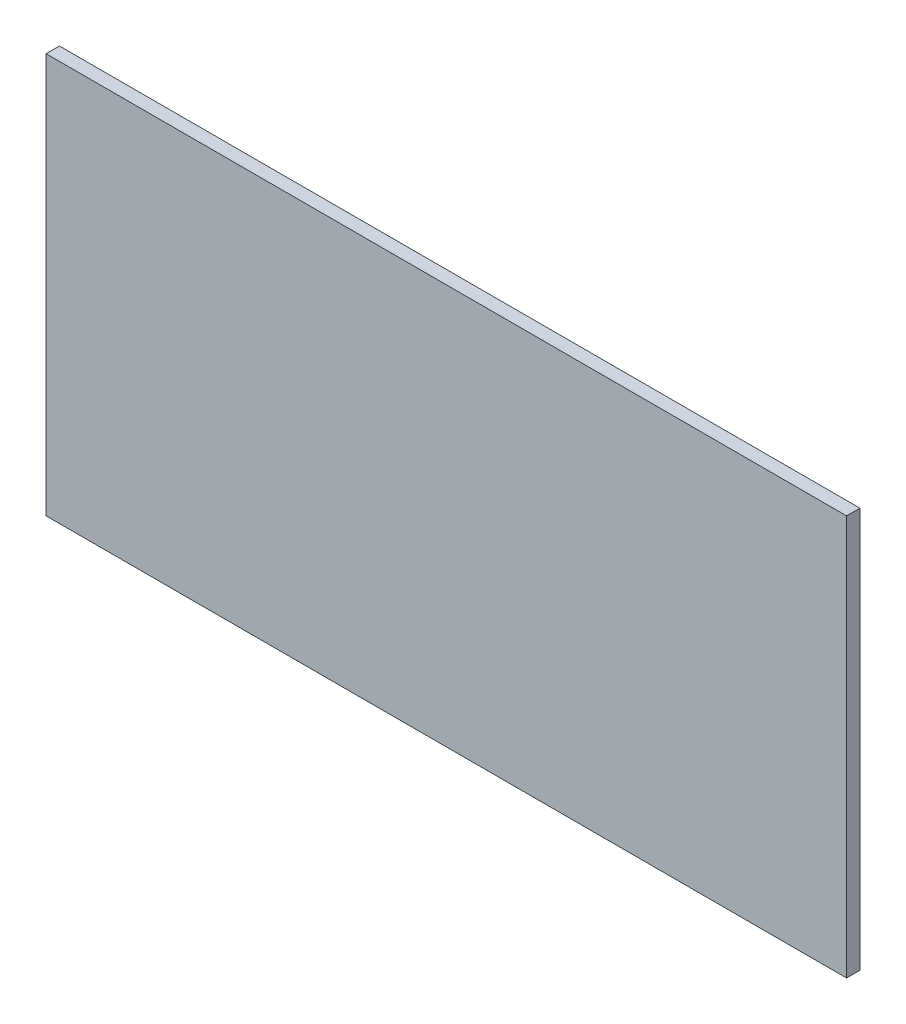
ISO-10303-21;
HEADER;
FILE_DESCRIPTION(('STEP AP214'),'2;1');
FILE_NAME('part.step','',(''),(''),'','','');
FILE_SCHEMA(('AUTOMOTIVE_DESIGN { 1 0 10303 214 1 1 1 1 }'));
ENDSEC;
DATA;
#1=APPLICATION_CONTEXT('core data for automotive mechanical design processes');
#2=APPLICATION_PROTOCOL_DEFINITION('international standard','automotive_design',2000,#1);
#3=PRODUCT_CONTEXT('',#1,'mechanical');
#4=PRODUCT('Part','Part','',(#3));
#5=PRODUCT_RELATED_PRODUCT_CATEGORY('part','',(#4));
#6=PRODUCT_DEFINITION_FORMATION('','',#4);
#7=PRODUCT_DEFINITION_CONTEXT('part definition',#1,'design');
#8=PRODUCT_DEFINITION('design','',#6,#7);
#9=PRODUCT_DEFINITION_SHAPE('','',#8);
#10=(LENGTH_UNIT() NAMED_UNIT(*) SI_UNIT(.MILLI.,.METRE.));
#11=(NAMED_UNIT(*) PLANE_ANGLE_UNIT() SI_UNIT($,.RADIAN.));
#12=(NAMED_UNIT(*) SI_UNIT($,.STERADIAN.) SOLID_ANGLE_UNIT());
#13=UNCERTAINTY_MEASURE_WITH_UNIT(LENGTH_MEASURE(1.E-05),#10,'distance_accuracy_value','');
#14=(GEOMETRIC_REPRESENTATION_CONTEXT(3) GLOBAL_UNCERTAINTY_ASSIGNED_CONTEXT((#13)) GLOBAL_UNIT_ASSIGNED_CONTEXT((#10,
#11,#12)) REPRESENTATION_CONTEXT('',''));
#15=CARTESIAN_POINT('',(0.,0.,0.));
#16=DIRECTION('',(0.,0.,1.));
#17=DIRECTION('',(1.,0.,0.));
#18=AXIS2_PLACEMENT_3D('',#15,#16,#17);
#19=CARTESIAN_POINT('',(150.,75.,5.));
#20=DIRECTION('',(-1.,0.,0.));
#21=DIRECTION('',(0.,0.,1.));
#22=AXIS2_PLACEMENT_3D('',#19,#20,#21);
#23=PLANE('',#22);
#24=DIRECTION('',(0.,1.,0.));
#25=VECTOR('',#24,1.);
#26=CARTESIAN_POINT('',(150.,75.,0.));
#27=LINE('',#26,#25);
#28=CARTESIAN_POINT('',(150.,-75.,0.));
#29=VERTEX_POINT('',#28);
#30=CARTESIAN_POINT('',(150.,75.,0.));
#31=VERTEX_POINT('',#30);
#32=EDGE_CURVE('E104',#29,#31,#27,.T.);
#33=ORIENTED_EDGE('',*,*,#32,.T.);
#34=DIRECTION('',(0.,0.,-1.));
#35=VECTOR('',#34,1.);
#36=CARTESIAN_POINT('',(150.,75.,5.));
#37=LINE('',#36,#35);
#38=CARTESIAN_POINT('',(150.,75.,5.));
#39=VERTEX_POINT('',#38);
#40=EDGE_CURVE('E11',#39,#31,#37,.T.);
#41=ORIENTED_EDGE('',*,*,#40,.F.);
#42=DIRECTION('',(0.,1.,0.));
#43=VECTOR('',#42,1.);
#44=CARTESIAN_POINT('',(150.,75.,5.));
#45=LINE('',#44,#43);
#46=CARTESIAN_POINT('',(150.,-75.,5.));
#47=VERTEX_POINT('',#46);
#48=EDGE_CURVE('E92',#47,#39,#45,.T.);
#49=ORIENTED_EDGE('',*,*,#48,.F.);
#50=DIRECTION('',(0.,0.,-1.));
#51=VECTOR('',#50,1.);
#52=CARTESIAN_POINT('',(150.,-75.,5.));
#53=LINE('',#52,#51);
#54=EDGE_CURVE('E100',#47,#29,#53,.T.);
#55=ORIENTED_EDGE('',*,*,#54,.T.);
#56=EDGE_LOOP('',(#33,#41,#49,#55));
#57=FACE_BOUND('',#56,.T.);
#58=ADVANCED_FACE('F41',(#57),#23,.F.);
#59=CARTESIAN_POINT('',(-150.,75.,5.));
#60=DIRECTION('',(0.,-1.,0.));
#61=DIRECTION('',(0.,0.,-1.));
#62=AXIS2_PLACEMENT_3D('',#59,#60,#61);
#63=PLANE('',#62);
#64=DIRECTION('',(-1.,0.,0.));
#65=VECTOR('',#64,1.);
#66=CARTESIAN_POINT('',(-150.,75.,0.));
#67=LINE('',#66,#65);
#68=CARTESIAN_POINT('',(-150.,75.,0.));
#69=VERTEX_POINT('',#68);
#70=EDGE_CURVE('E96',#31,#69,#67,.T.);
#71=ORIENTED_EDGE('',*,*,#70,.T.);
#72=DIRECTION('',(0.,0.,-1.));
#73=VECTOR('',#72,1.);
#74=CARTESIAN_POINT('',(-150.,75.,5.));
#75=LINE('',#74,#73);
#76=CARTESIAN_POINT('',(-150.,75.,5.));
#77=VERTEX_POINT('',#76);
#78=EDGE_CURVE('E49',#77,#69,#75,.T.);
#79=ORIENTED_EDGE('',*,*,#78,.F.);
#80=DIRECTION('',(-1.,0.,0.));
#81=VECTOR('',#80,1.);
#82=CARTESIAN_POINT('',(-150.,75.,5.));
#83=LINE('',#82,#81);
#84=EDGE_CURVE('E87',#39,#77,#83,.T.);
#85=ORIENTED_EDGE('',*,*,#84,.F.);
#86=ORIENTED_EDGE('',*,*,#40,.T.);
#87=EDGE_LOOP('',(#71,#79,#85,#86));
#88=FACE_BOUND('',#87,.T.);
#89=ADVANCED_FACE('F95',(#88),#63,.F.);
#90=CARTESIAN_POINT('',(-150.,75.,5.));
#91=DIRECTION('',(1.,0.,0.));
#92=DIRECTION('',(0.,0.,-1.));
#93=AXIS2_PLACEMENT_3D('',#90,#91,#92);
#94=PLANE('',#93);
#95=DIRECTION('',(0.,-1.,0.));
#96=VECTOR('',#95,1.);
#97=CARTESIAN_POINT('',(-150.,75.,0.));
#98=LINE('',#97,#96);
#99=CARTESIAN_POINT('',(-150.,-75.,0.));
#100=VERTEX_POINT('',#99);
#101=EDGE_CURVE('E74',#69,#100,#98,.T.);
#102=ORIENTED_EDGE('',*,*,#101,.T.);
#103=DIRECTION('',(0.,0.,-1.));
#104=VECTOR('',#103,1.);
#105=CARTESIAN_POINT('',(-150.,-75.,5.));
#106=LINE('',#105,#104);
#107=CARTESIAN_POINT('',(-150.,-75.,5.));
#108=VERTEX_POINT('',#107);
#109=EDGE_CURVE('E97',#108,#100,#106,.T.);
#110=ORIENTED_EDGE('',*,*,#109,.F.);
#111=DIRECTION('',(0.,-1.,0.));
#112=VECTOR('',#111,1.);
#113=CARTESIAN_POINT('',(-150.,75.,5.));
#114=LINE('',#113,#112);
#115=EDGE_CURVE('E90',#77,#108,#114,.T.);
#116=ORIENTED_EDGE('',*,*,#115,.F.);
#117=ORIENTED_EDGE('',*,*,#78,.T.);
#118=EDGE_LOOP('',(#102,#110,#116,#117));
#119=FACE_BOUND('',#118,.T.);
#120=ADVANCED_FACE('F98',(#119),#94,.F.);
#121=CARTESIAN_POINT('',(-150.,-75.,5.));
#122=DIRECTION('',(0.,1.,0.));
#123=DIRECTION('',(0.,0.,1.));
#124=AXIS2_PLACEMENT_3D('',#121,#122,#123);
#125=PLANE('',#124);
#126=DIRECTION('',(1.,0.,0.));
#127=VECTOR('',#126,1.);
#128=CARTESIAN_POINT('',(-150.,-75.,0.));
#129=LINE('',#128,#127);
#130=EDGE_CURVE('E80',#100,#29,#129,.T.);
#131=ORIENTED_EDGE('',*,*,#130,.T.);
#132=ORIENTED_EDGE('',*,*,#54,.F.);
#133=DIRECTION('',(1.,0.,0.));
#134=VECTOR('',#133,1.);
#135=CARTESIAN_POINT('',(-150.,-75.,5.));
#136=LINE('',#135,#134);
#137=EDGE_CURVE('E57',#108,#47,#136,.T.);
#138=ORIENTED_EDGE('',*,*,#137,.F.);
#139=ORIENTED_EDGE('',*,*,#109,.T.);
#140=EDGE_LOOP('',(#131,#132,#138,#139));
#141=FACE_BOUND('',#140,.T.);
#142=ADVANCED_FACE('F111',(#141),#125,.F.);
#143=CARTESIAN_POINT('',(0.,0.,5.));
#144=DIRECTION('',(0.,0.,1.));
#145=DIRECTION('',(1.,0.,0.));
#146=AXIS2_PLACEMENT_3D('',#143,#144,#145);
#147=PLANE('',#146);
#148=ORIENTED_EDGE('',*,*,#48,.T.);
#149=ORIENTED_EDGE('',*,*,#84,.T.);
#150=ORIENTED_EDGE('',*,*,#115,.T.);
#151=ORIENTED_EDGE('',*,*,#137,.T.);
#152=EDGE_LOOP('',(#148,#149,#150,#151));
#153=FACE_BOUND('',#152,.T.);
#154=ADVANCED_FACE('F88',(#153),#147,.T.);
#155=CARTESIAN_POINT('',(0.,0.,0.));
#156=DIRECTION('',(0.,0.,1.));
#157=DIRECTION('',(1.,0.,0.));
#158=AXIS2_PLACEMENT_3D('',#155,#156,#157);
#159=PLANE('',#158);
#160=ORIENTED_EDGE('',*,*,#32,.F.);
#161=ORIENTED_EDGE('',*,*,#130,.F.);
#162=ORIENTED_EDGE('',*,*,#101,.F.);
#163=ORIENTED_EDGE('',*,*,#70,.F.);
#164=EDGE_LOOP('',(#160,#161,#162,#163));
#165=FACE_BOUND('',#164,.T.);
#166=ADVANCED_FACE('F114',(#165),#159,.F.);
#167=CLOSED_SHELL('',(#58,#89,#120,#142,#154,#166));
#168=MANIFOLD_SOLID_BREP('B2',#167);
#169=ADVANCED_BREP_SHAPE_REPRESENTATION('',(#18,#168),#14);
#170=SHAPE_DEFINITION_REPRESENTATION(#9,#169);
ENDSEC;
END-ISO-10303-21;
